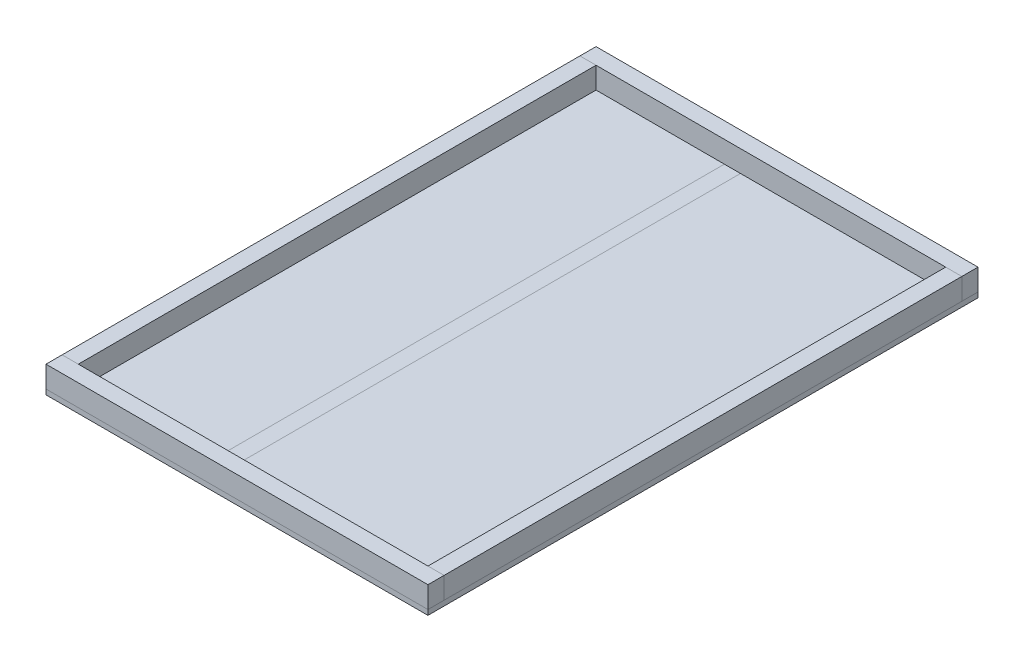
ISO-10303-21;
HEADER;
FILE_DESCRIPTION(('STEP AP214'),'2;1');
FILE_NAME('part.step','',(''),(''),'','','');
FILE_SCHEMA(('AUTOMOTIVE_DESIGN { 1 0 10303 214 1 1 1 1 }'));
ENDSEC;
DATA;
#1=APPLICATION_CONTEXT('core data for automotive mechanical design processes');
#2=APPLICATION_PROTOCOL_DEFINITION('international standard','automotive_design',2000,#1);
#3=PRODUCT_CONTEXT('',#1,'mechanical');
#4=PRODUCT('Part','Part','',(#3));
#5=PRODUCT_RELATED_PRODUCT_CATEGORY('part','',(#4));
#6=PRODUCT_DEFINITION_FORMATION('','',#4);
#7=PRODUCT_DEFINITION_CONTEXT('part definition',#1,'design');
#8=PRODUCT_DEFINITION('design','',#6,#7);
#9=PRODUCT_DEFINITION_SHAPE('','',#8);
#10=(LENGTH_UNIT() NAMED_UNIT(*) SI_UNIT(.MILLI.,.METRE.));
#11=(NAMED_UNIT(*) PLANE_ANGLE_UNIT() SI_UNIT($,.RADIAN.));
#12=(NAMED_UNIT(*) SI_UNIT($,.STERADIAN.) SOLID_ANGLE_UNIT());
#13=UNCERTAINTY_MEASURE_WITH_UNIT(LENGTH_MEASURE(1.E-05),#10,'distance_accuracy_value','');
#14=(GEOMETRIC_REPRESENTATION_CONTEXT(3) GLOBAL_UNCERTAINTY_ASSIGNED_CONTEXT((#13)) GLOBAL_UNIT_ASSIGNED_CONTEXT((#10,
#11,#12)) REPRESENTATION_CONTEXT('',''));
#15=CARTESIAN_POINT('',(0.,0.,0.));
#16=DIRECTION('',(0.,0.,1.));
#17=DIRECTION('',(1.,0.,0.));
#18=AXIS2_PLACEMENT_3D('',#15,#16,#17);
#19=CARTESIAN_POINT('',(-35.8750000000001,-9.525,305.55));
#20=DIRECTION('',(1.,0.,0.));
#21=DIRECTION('',(0.,0.,-1.));
#22=AXIS2_PLACEMENT_3D('',#19,#20,#21);
#23=PLANE('',#22);
#24=DIRECTION('',(0.,0.,-1.));
#25=VECTOR('',#24,1.);
#26=CARTESIAN_POINT('',(-35.8750000000001,0.,305.55));
#27=LINE('',#26,#25);
#28=CARTESIAN_POINT('',(-35.8750000000001,0.,305.55));
#29=VERTEX_POINT('',#28);
#30=CARTESIAN_POINT('',(-35.8750000000001,0.,-305.55));
#31=VERTEX_POINT('',#30);
#32=EDGE_CURVE('E142',#29,#31,#27,.T.);
#33=ORIENTED_EDGE('',*,*,#32,.F.);
#34=DIRECTION('',(0.,1.,0.));
#35=VECTOR('',#34,1.);
#36=CARTESIAN_POINT('',(-35.8750000000001,-9.525,305.55));
#37=LINE('',#36,#35);
#38=CARTESIAN_POINT('',(-35.8750000000001,-9.525,305.55));
#39=VERTEX_POINT('',#38);
#40=EDGE_CURVE('E13',#39,#29,#37,.T.);
#41=ORIENTED_EDGE('',*,*,#40,.F.);
#42=DIRECTION('',(0.,0.,-1.));
#43=VECTOR('',#42,1.);
#44=CARTESIAN_POINT('',(-35.8750000000001,-9.525,305.55));
#45=LINE('',#44,#43);
#46=CARTESIAN_POINT('',(-35.8750000000001,-9.525,-305.55));
#47=VERTEX_POINT('',#46);
#48=EDGE_CURVE('E136',#39,#47,#45,.T.);
#49=ORIENTED_EDGE('',*,*,#48,.T.);
#50=DIRECTION('',(0.,1.,0.));
#51=VECTOR('',#50,1.);
#52=CARTESIAN_POINT('',(-35.8750000000001,-9.525,-305.55));
#53=LINE('',#52,#51);
#54=EDGE_CURVE('E81',#47,#31,#53,.T.);
#55=ORIENTED_EDGE('',*,*,#54,.T.);
#56=EDGE_LOOP('',(#33,#41,#49,#55));
#57=FACE_BOUND('',#56,.T.);
#58=ADVANCED_FACE('F78',(#57),#23,.T.);
#59=CARTESIAN_POINT('',(-54.9250000000001,-9.525,305.55));
#60=DIRECTION('',(0.,0.,1.));
#61=DIRECTION('',(1.,0.,0.));
#62=AXIS2_PLACEMENT_3D('',#59,#60,#61);
#63=PLANE('',#62);
#64=DIRECTION('',(1.,0.,0.));
#65=VECTOR('',#64,1.);
#66=CARTESIAN_POINT('',(-54.9250000000001,0.,305.55));
#67=LINE('',#66,#65);
#68=CARTESIAN_POINT('',(-54.9250000000001,0.,305.55));
#69=VERTEX_POINT('',#68);
#70=EDGE_CURVE('E138',#69,#29,#67,.T.);
#71=ORIENTED_EDGE('',*,*,#70,.F.);
#72=DIRECTION('',(0.,1.,0.));
#73=VECTOR('',#72,1.);
#74=CARTESIAN_POINT('',(-54.9250000000001,-9.525,305.55));
#75=LINE('',#74,#73);
#76=CARTESIAN_POINT('',(-54.9250000000001,-9.525,305.55));
#77=VERTEX_POINT('',#76);
#78=EDGE_CURVE('E87',#77,#69,#75,.T.);
#79=ORIENTED_EDGE('',*,*,#78,.F.);
#80=DIRECTION('',(1.,0.,0.));
#81=VECTOR('',#80,1.);
#82=CARTESIAN_POINT('',(-54.9250000000001,-9.525,305.55));
#83=LINE('',#82,#81);
#84=EDGE_CURVE('E133',#77,#39,#83,.T.);
#85=ORIENTED_EDGE('',*,*,#84,.T.);
#86=ORIENTED_EDGE('',*,*,#40,.T.);
#87=EDGE_LOOP('',(#71,#79,#85,#86));
#88=FACE_BOUND('',#87,.T.);
#89=ADVANCED_FACE('F152',(#88),#63,.T.);
#90=CARTESIAN_POINT('',(-54.9250000000001,-9.525,305.55));
#91=DIRECTION('',(-1.,0.,0.));
#92=DIRECTION('',(0.,0.,1.));
#93=AXIS2_PLACEMENT_3D('',#90,#91,#92);
#94=PLANE('',#93);
#95=DIRECTION('',(0.,0.,1.));
#96=VECTOR('',#95,1.);
#97=CARTESIAN_POINT('',(-54.9250000000001,0.,305.55));
#98=LINE('',#97,#96);
#99=CARTESIAN_POINT('',(-54.9250000000001,0.,-305.55));
#100=VERTEX_POINT('',#99);
#101=EDGE_CURVE('E128',#100,#69,#98,.T.);
#102=ORIENTED_EDGE('',*,*,#101,.F.);
#103=DIRECTION('',(0.,1.,0.));
#104=VECTOR('',#103,1.);
#105=CARTESIAN_POINT('',(-54.9250000000001,-9.525,-305.55));
#106=LINE('',#105,#104);
#107=CARTESIAN_POINT('',(-54.9250000000001,-9.525,-305.55));
#108=VERTEX_POINT('',#107);
#109=EDGE_CURVE('E123',#108,#100,#106,.T.);
#110=ORIENTED_EDGE('',*,*,#109,.F.);
#111=DIRECTION('',(0.,0.,1.));
#112=VECTOR('',#111,1.);
#113=CARTESIAN_POINT('',(-54.9250000000001,-9.525,305.55));
#114=LINE('',#113,#112);
#115=EDGE_CURVE('E126',#108,#77,#114,.T.);
#116=ORIENTED_EDGE('',*,*,#115,.T.);
#117=ORIENTED_EDGE('',*,*,#78,.T.);
#118=EDGE_LOOP('',(#102,#110,#116,#117));
#119=FACE_BOUND('',#118,.T.);
#120=ADVANCED_FACE('F125',(#119),#94,.T.);
#121=CARTESIAN_POINT('',(-54.9250000000001,-9.525,-305.55));
#122=DIRECTION('',(0.,0.,-1.));
#123=DIRECTION('',(-1.,0.,0.));
#124=AXIS2_PLACEMENT_3D('',#121,#122,#123);
#125=PLANE('',#124);
#126=DIRECTION('',(-1.,0.,0.));
#127=VECTOR('',#126,1.);
#128=CARTESIAN_POINT('',(-54.9250000000001,0.,-305.55));
#129=LINE('',#128,#127);
#130=EDGE_CURVE('E145',#31,#100,#129,.T.);
#131=ORIENTED_EDGE('',*,*,#130,.F.);
#132=ORIENTED_EDGE('',*,*,#54,.F.);
#133=DIRECTION('',(-1.,0.,0.));
#134=VECTOR('',#133,1.);
#135=CARTESIAN_POINT('',(-54.9250000000001,-9.525,-305.55));
#136=LINE('',#135,#134);
#137=EDGE_CURVE('E132',#47,#108,#136,.T.);
#138=ORIENTED_EDGE('',*,*,#137,.T.);
#139=ORIENTED_EDGE('',*,*,#109,.T.);
#140=EDGE_LOOP('',(#131,#132,#138,#139));
#141=FACE_BOUND('',#140,.T.);
#142=ADVANCED_FACE('F135',(#141),#125,.T.);
#143=CARTESIAN_POINT('',(0.,-9.525,0.));
#144=DIRECTION('',(0.,-1.,0.));
#145=DIRECTION('',(0.,0.,-1.));
#146=AXIS2_PLACEMENT_3D('',#143,#144,#145);
#147=PLANE('',#146);
#148=ORIENTED_EDGE('',*,*,#48,.F.);
#149=ORIENTED_EDGE('',*,*,#84,.F.);
#150=ORIENTED_EDGE('',*,*,#115,.F.);
#151=ORIENTED_EDGE('',*,*,#137,.F.);
#152=EDGE_LOOP('',(#148,#149,#150,#151));
#153=FACE_BOUND('',#152,.T.);
#154=ADVANCED_FACE('F131',(#153),#147,.T.);
#155=CARTESIAN_POINT('',(0.,0.,0.));
#156=DIRECTION('',(0.,-1.,0.));
#157=DIRECTION('',(0.,0.,-1.));
#158=AXIS2_PLACEMENT_3D('',#155,#156,#157);
#159=PLANE('',#158);
#160=ORIENTED_EDGE('',*,*,#32,.T.);
#161=ORIENTED_EDGE('',*,*,#130,.T.);
#162=ORIENTED_EDGE('',*,*,#101,.T.);
#163=ORIENTED_EDGE('',*,*,#70,.T.);
#164=EDGE_LOOP('',(#160,#161,#162,#163));
#165=FACE_BOUND('',#164,.T.);
#166=ADVANCED_FACE('F151',(#165),#159,.F.);
#167=CLOSED_SHELL('',(#58,#89,#120,#142,#154,#166));
#168=MANIFOLD_SOLID_BREP('B2',#167);
#169=CARTESIAN_POINT('',(0.,25.4,305.55));
#170=DIRECTION('',(0.,0.,-1.));
#171=DIRECTION('',(-1.,0.,0.));
#172=AXIS2_PLACEMENT_3D('',#169,#170,#171);
#173=PLANE('',#172);
#174=DIRECTION('',(1.,0.,0.));
#175=VECTOR('',#174,1.);
#176=CARTESIAN_POINT('',(0.,0.,305.55));
#177=LINE('',#176,#175);
#178=CARTESIAN_POINT('',(-225.4,0.,305.55));
#179=VERTEX_POINT('',#178);
#180=CARTESIAN_POINT('',(225.4,0.,305.55));
#181=VERTEX_POINT('',#180);
#182=EDGE_CURVE('E276',#179,#181,#177,.T.);
#183=ORIENTED_EDGE('',*,*,#182,.F.);
#184=DIRECTION('',(0.,-1.,0.));
#185=VECTOR('',#184,1.);
#186=CARTESIAN_POINT('',(-225.4,25.4,305.55));
#187=LINE('',#186,#185);
#188=CARTESIAN_POINT('',(-225.4,25.4,305.55));
#189=VERTEX_POINT('',#188);
#190=EDGE_CURVE('E76',#189,#179,#187,.T.);
#191=ORIENTED_EDGE('',*,*,#190,.F.);
#192=DIRECTION('',(1.,0.,0.));
#193=VECTOR('',#192,1.);
#194=CARTESIAN_POINT('',(0.,25.4,305.55));
#195=LINE('',#194,#193);
#196=CARTESIAN_POINT('',(225.4,25.4,305.55));
#197=VERTEX_POINT('',#196);
#198=EDGE_CURVE('E270',#189,#197,#195,.T.);
#199=ORIENTED_EDGE('',*,*,#198,.T.);
#200=DIRECTION('',(0.,-1.,0.));
#201=VECTOR('',#200,1.);
#202=CARTESIAN_POINT('',(225.4,25.4,305.55));
#203=LINE('',#202,#201);
#204=EDGE_CURVE('E251',#197,#181,#203,.T.);
#205=ORIENTED_EDGE('',*,*,#204,.T.);
#206=EDGE_LOOP('',(#183,#191,#199,#205));
#207=FACE_BOUND('',#206,.T.);
#208=ADVANCED_FACE('F213',(#207),#173,.T.);
#209=CARTESIAN_POINT('',(-225.4,25.4,0.));
#210=DIRECTION('',(-1.,0.,0.));
#211=DIRECTION('',(0.,0.,1.));
#212=AXIS2_PLACEMENT_3D('',#209,#210,#211);
#213=PLANE('',#212);
#214=DIRECTION('',(0.,0.,-1.));
#215=VECTOR('',#214,1.);
#216=CARTESIAN_POINT('',(-225.4,0.,0.));
#217=LINE('',#216,#215);
#218=CARTESIAN_POINT('',(-225.4,0.,324.6));
#219=VERTEX_POINT('',#218);
#220=EDGE_CURVE('E264',#219,#179,#217,.T.);
#221=ORIENTED_EDGE('',*,*,#220,.F.);
#222=DIRECTION('',(0.,-1.,0.));
#223=VECTOR('',#222,1.);
#224=CARTESIAN_POINT('',(-225.4,25.4,324.6));
#225=LINE('',#224,#223);
#226=CARTESIAN_POINT('',(-225.4,25.4,324.6));
#227=VERTEX_POINT('',#226);
#228=EDGE_CURVE('E221',#227,#219,#225,.T.);
#229=ORIENTED_EDGE('',*,*,#228,.F.);
#230=DIRECTION('',(0.,0.,-1.));
#231=VECTOR('',#230,1.);
#232=CARTESIAN_POINT('',(-225.4,25.4,0.));
#233=LINE('',#232,#231);
#234=EDGE_CURVE('E262',#227,#189,#233,.T.);
#235=ORIENTED_EDGE('',*,*,#234,.T.);
#236=ORIENTED_EDGE('',*,*,#190,.T.);
#237=EDGE_LOOP('',(#221,#229,#235,#236));
#238=FACE_BOUND('',#237,.T.);
#239=ADVANCED_FACE('F260',(#238),#213,.T.);
#240=CARTESIAN_POINT('',(0.,25.4,324.6));
#241=DIRECTION('',(0.,0.,-1.));
#242=DIRECTION('',(-1.,0.,0.));
#243=AXIS2_PLACEMENT_3D('',#240,#241,#242);
#244=PLANE('',#243);
#245=DIRECTION('',(1.,0.,0.));
#246=VECTOR('',#245,1.);
#247=CARTESIAN_POINT('',(0.,0.,324.6));
#248=LINE('',#247,#246);
#249=CARTESIAN_POINT('',(225.4,0.,324.6));
#250=VERTEX_POINT('',#249);
#251=EDGE_CURVE('E244',#219,#250,#248,.T.);
#252=ORIENTED_EDGE('',*,*,#251,.T.);
#253=DIRECTION('',(0.,-1.,0.));
#254=VECTOR('',#253,1.);
#255=CARTESIAN_POINT('',(225.4,25.4,324.6));
#256=LINE('',#255,#254);
#257=CARTESIAN_POINT('',(225.4,25.4,324.6));
#258=VERTEX_POINT('',#257);
#259=EDGE_CURVE('E265',#258,#250,#256,.T.);
#260=ORIENTED_EDGE('',*,*,#259,.F.);
#261=DIRECTION('',(1.,0.,0.));
#262=VECTOR('',#261,1.);
#263=CARTESIAN_POINT('',(0.,25.4,324.6));
#264=LINE('',#263,#262);
#265=EDGE_CURVE('E266',#227,#258,#264,.T.);
#266=ORIENTED_EDGE('',*,*,#265,.F.);
#267=ORIENTED_EDGE('',*,*,#228,.T.);
#268=EDGE_LOOP('',(#252,#260,#266,#267));
#269=FACE_BOUND('',#268,.T.);
#270=ADVANCED_FACE('F267',(#269),#244,.F.);
#271=CARTESIAN_POINT('',(225.4,25.4,0.));
#272=DIRECTION('',(-1.,0.,0.));
#273=DIRECTION('',(0.,0.,1.));
#274=AXIS2_PLACEMENT_3D('',#271,#272,#273);
#275=PLANE('',#274);
#276=DIRECTION('',(0.,0.,-1.));
#277=VECTOR('',#276,1.);
#278=CARTESIAN_POINT('',(225.4,0.,0.));
#279=LINE('',#278,#277);
#280=EDGE_CURVE('E272',#250,#181,#279,.T.);
#281=ORIENTED_EDGE('',*,*,#280,.T.);
#282=ORIENTED_EDGE('',*,*,#204,.F.);
#283=DIRECTION('',(0.,0.,-1.));
#284=VECTOR('',#283,1.);
#285=CARTESIAN_POINT('',(225.4,25.4,0.));
#286=LINE('',#285,#284);
#287=EDGE_CURVE('E229',#258,#197,#286,.T.);
#288=ORIENTED_EDGE('',*,*,#287,.F.);
#289=ORIENTED_EDGE('',*,*,#259,.T.);
#290=EDGE_LOOP('',(#281,#282,#288,#289));
#291=FACE_BOUND('',#290,.T.);
#292=ADVANCED_FACE('F285',(#291),#275,.F.);
#293=CARTESIAN_POINT('',(0.,25.4,0.));
#294=DIRECTION('',(0.,1.,0.));
#295=DIRECTION('',(0.,0.,1.));
#296=AXIS2_PLACEMENT_3D('',#293,#294,#295);
#297=PLANE('',#296);
#298=ORIENTED_EDGE('',*,*,#198,.F.);
#299=ORIENTED_EDGE('',*,*,#234,.F.);
#300=ORIENTED_EDGE('',*,*,#265,.T.);
#301=ORIENTED_EDGE('',*,*,#287,.T.);
#302=EDGE_LOOP('',(#298,#299,#300,#301));
#303=FACE_BOUND('',#302,.T.);
#304=ADVANCED_FACE('F269',(#303),#297,.T.);
#305=CARTESIAN_POINT('',(0.,0.,0.));
#306=DIRECTION('',(0.,1.,0.));
#307=DIRECTION('',(0.,0.,1.));
#308=AXIS2_PLACEMENT_3D('',#305,#306,#307);
#309=PLANE('',#308);
#310=ORIENTED_EDGE('',*,*,#182,.T.);
#311=ORIENTED_EDGE('',*,*,#280,.F.);
#312=ORIENTED_EDGE('',*,*,#251,.F.);
#313=ORIENTED_EDGE('',*,*,#220,.T.);
#314=EDGE_LOOP('',(#310,#311,#312,#313));
#315=FACE_BOUND('',#314,.T.);
#316=ADVANCED_FACE('F287',(#315),#309,.F.);
#317=CLOSED_SHELL('',(#208,#239,#270,#292,#304,#316));
#318=MANIFOLD_SOLID_BREP('B7',#317);
#319=CARTESIAN_POINT('',(0.,25.4,-305.55));
#320=DIRECTION('',(0.,0.,1.));
#321=DIRECTION('',(1.,0.,0.));
#322=AXIS2_PLACEMENT_3D('',#319,#320,#321);
#323=PLANE('',#322);
#324=DIRECTION('',(-1.,0.,0.));
#325=VECTOR('',#324,1.);
#326=CARTESIAN_POINT('',(0.,0.,-305.55));
#327=LINE('',#326,#325);
#328=CARTESIAN_POINT('',(225.4,0.,-305.55));
#329=VERTEX_POINT('',#328);
#330=CARTESIAN_POINT('',(-225.4,0.,-305.55));
#331=VERTEX_POINT('',#330);
#332=EDGE_CURVE('E415',#329,#331,#327,.T.);
#333=ORIENTED_EDGE('',*,*,#332,.F.);
#334=DIRECTION('',(0.,-1.,0.));
#335=VECTOR('',#334,1.);
#336=CARTESIAN_POINT('',(225.4,25.4,-305.55));
#337=LINE('',#336,#335);
#338=CARTESIAN_POINT('',(225.4,25.4,-305.55));
#339=VERTEX_POINT('',#338);
#340=EDGE_CURVE('E211',#339,#329,#337,.T.);
#341=ORIENTED_EDGE('',*,*,#340,.F.);
#342=DIRECTION('',(-1.,0.,0.));
#343=VECTOR('',#342,1.);
#344=CARTESIAN_POINT('',(0.,25.4,-305.55));
#345=LINE('',#344,#343);
#346=CARTESIAN_POINT('',(-225.4,25.4,-305.55));
#347=VERTEX_POINT('',#346);
#348=EDGE_CURVE('E400',#339,#347,#345,.T.);
#349=ORIENTED_EDGE('',*,*,#348,.T.);
#350=DIRECTION('',(0.,-1.,0.));
#351=VECTOR('',#350,1.);
#352=CARTESIAN_POINT('',(-225.4,25.4,-305.55));
#353=LINE('',#352,#351);
#354=EDGE_CURVE('E368',#347,#331,#353,.T.);
#355=ORIENTED_EDGE('',*,*,#354,.T.);
#356=EDGE_LOOP('',(#333,#341,#349,#355));
#357=FACE_BOUND('',#356,.T.);
#358=ADVANCED_FACE('F352',(#357),#323,.T.);
#359=CARTESIAN_POINT('',(225.4,25.4,0.));
#360=DIRECTION('',(-1.,0.,0.));
#361=DIRECTION('',(0.,0.,1.));
#362=AXIS2_PLACEMENT_3D('',#359,#360,#361);
#363=PLANE('',#362);
#364=DIRECTION('',(0.,0.,-1.));
#365=VECTOR('',#364,1.);
#366=CARTESIAN_POINT('',(225.4,0.,0.));
#367=LINE('',#366,#365);
#368=CARTESIAN_POINT('',(225.4,0.,-324.6));
#369=VERTEX_POINT('',#368);
#370=EDGE_CURVE('E406',#329,#369,#367,.T.);
#371=ORIENTED_EDGE('',*,*,#370,.T.);
#372=DIRECTION('',(0.,-1.,0.));
#373=VECTOR('',#372,1.);
#374=CARTESIAN_POINT('',(225.4,25.4,-324.6));
#375=LINE('',#374,#373);
#376=CARTESIAN_POINT('',(225.4,25.4,-324.6));
#377=VERTEX_POINT('',#376);
#378=EDGE_CURVE('E360',#377,#369,#375,.T.);
#379=ORIENTED_EDGE('',*,*,#378,.F.);
#380=DIRECTION('',(0.,0.,-1.));
#381=VECTOR('',#380,1.);
#382=CARTESIAN_POINT('',(225.4,25.4,0.));
#383=LINE('',#382,#381);
#384=EDGE_CURVE('E394',#339,#377,#383,.T.);
#385=ORIENTED_EDGE('',*,*,#384,.F.);
#386=ORIENTED_EDGE('',*,*,#340,.T.);
#387=EDGE_LOOP('',(#371,#379,#385,#386));
#388=FACE_BOUND('',#387,.T.);
#389=ADVANCED_FACE('F404',(#388),#363,.F.);
#390=CARTESIAN_POINT('',(0.,25.4,-324.6));
#391=DIRECTION('',(0.,0.,-1.));
#392=DIRECTION('',(-1.,0.,0.));
#393=AXIS2_PLACEMENT_3D('',#390,#391,#392);
#394=PLANE('',#393);
#395=DIRECTION('',(1.,0.,0.));
#396=VECTOR('',#395,1.);
#397=CARTESIAN_POINT('',(0.,0.,-324.6));
#398=LINE('',#397,#396);
#399=CARTESIAN_POINT('',(-225.4,0.,-324.6));
#400=VERTEX_POINT('',#399);
#401=EDGE_CURVE('E418',#400,#369,#398,.T.);
#402=ORIENTED_EDGE('',*,*,#401,.F.);
#403=DIRECTION('',(0.,-1.,0.));
#404=VECTOR('',#403,1.);
#405=CARTESIAN_POINT('',(-225.4,25.4,-324.6));
#406=LINE('',#405,#404);
#407=CARTESIAN_POINT('',(-225.4,25.4,-324.6));
#408=VERTEX_POINT('',#407);
#409=EDGE_CURVE('E381',#408,#400,#406,.T.);
#410=ORIENTED_EDGE('',*,*,#409,.F.);
#411=DIRECTION('',(1.,0.,0.));
#412=VECTOR('',#411,1.);
#413=CARTESIAN_POINT('',(0.,25.4,-324.6));
#414=LINE('',#413,#412);
#415=EDGE_CURVE('E399',#408,#377,#414,.T.);
#416=ORIENTED_EDGE('',*,*,#415,.T.);
#417=ORIENTED_EDGE('',*,*,#378,.T.);
#418=EDGE_LOOP('',(#402,#410,#416,#417));
#419=FACE_BOUND('',#418,.T.);
#420=ADVANCED_FACE('F409',(#419),#394,.T.);
#421=CARTESIAN_POINT('',(-225.4,25.4,0.));
#422=DIRECTION('',(-1.,0.,0.));
#423=DIRECTION('',(0.,0.,1.));
#424=AXIS2_PLACEMENT_3D('',#421,#422,#423);
#425=PLANE('',#424);
#426=DIRECTION('',(0.,0.,-1.));
#427=VECTOR('',#426,1.);
#428=CARTESIAN_POINT('',(-225.4,0.,0.));
#429=LINE('',#428,#427);
#430=EDGE_CURVE('E420',#331,#400,#429,.T.);
#431=ORIENTED_EDGE('',*,*,#430,.F.);
#432=ORIENTED_EDGE('',*,*,#354,.F.);
#433=DIRECTION('',(0.,0.,-1.));
#434=VECTOR('',#433,1.);
#435=CARTESIAN_POINT('',(-225.4,25.4,0.));
#436=LINE('',#435,#434);
#437=EDGE_CURVE('E410',#347,#408,#436,.T.);
#438=ORIENTED_EDGE('',*,*,#437,.T.);
#439=ORIENTED_EDGE('',*,*,#409,.T.);
#440=EDGE_LOOP('',(#431,#432,#438,#439));
#441=FACE_BOUND('',#440,.T.);
#442=ADVANCED_FACE('F425',(#441),#425,.T.);
#443=CARTESIAN_POINT('',(0.,25.4,0.));
#444=DIRECTION('',(0.,1.,0.));
#445=DIRECTION('',(0.,0.,1.));
#446=AXIS2_PLACEMENT_3D('',#443,#444,#445);
#447=PLANE('',#446);
#448=ORIENTED_EDGE('',*,*,#348,.F.);
#449=ORIENTED_EDGE('',*,*,#384,.T.);
#450=ORIENTED_EDGE('',*,*,#415,.F.);
#451=ORIENTED_EDGE('',*,*,#437,.F.);
#452=EDGE_LOOP('',(#448,#449,#450,#451));
#453=FACE_BOUND('',#452,.T.);
#454=ADVANCED_FACE('F396',(#453),#447,.T.);
#455=CARTESIAN_POINT('',(0.,0.,0.));
#456=DIRECTION('',(0.,1.,0.));
#457=DIRECTION('',(0.,0.,1.));
#458=AXIS2_PLACEMENT_3D('',#455,#456,#457);
#459=PLANE('',#458);
#460=ORIENTED_EDGE('',*,*,#332,.T.);
#461=ORIENTED_EDGE('',*,*,#430,.T.);
#462=ORIENTED_EDGE('',*,*,#401,.T.);
#463=ORIENTED_EDGE('',*,*,#370,.F.);
#464=EDGE_LOOP('',(#460,#461,#462,#463));
#465=FACE_BOUND('',#464,.T.);
#466=ADVANCED_FACE('F432',(#465),#459,.F.);
#467=CLOSED_SHELL('',(#358,#389,#420,#442,#454,#466));
#468=MANIFOLD_SOLID_BREP('B70',#467);
#469=CARTESIAN_POINT('',(206.35,25.4,0.));
#470=DIRECTION('',(-1.,0.,0.));
#471=DIRECTION('',(0.,0.,1.));
#472=AXIS2_PLACEMENT_3D('',#469,#470,#471);
#473=PLANE('',#472);
#474=DIRECTION('',(0.,0.,-1.));
#475=VECTOR('',#474,1.);
#476=CARTESIAN_POINT('',(206.35,0.,0.));
#477=LINE('',#476,#475);
#478=CARTESIAN_POINT('',(206.35,0.,305.55));
#479=VERTEX_POINT('',#478);
#480=CARTESIAN_POINT('',(206.35,0.,-305.55));
#481=VERTEX_POINT('',#480);
#482=EDGE_CURVE('E554',#479,#481,#477,.T.);
#483=ORIENTED_EDGE('',*,*,#482,.F.);
#484=DIRECTION('',(0.,-1.,0.));
#485=VECTOR('',#484,1.);
#486=CARTESIAN_POINT('',(206.35,25.4,305.55));
#487=LINE('',#486,#485);
#488=CARTESIAN_POINT('',(206.35,25.4,305.55));
#489=VERTEX_POINT('',#488);
#490=EDGE_CURVE('E350',#489,#479,#487,.T.);
#491=ORIENTED_EDGE('',*,*,#490,.F.);
#492=DIRECTION('',(0.,0.,-1.));
#493=VECTOR('',#492,1.);
#494=CARTESIAN_POINT('',(206.35,25.4,0.));
#495=LINE('',#494,#493);
#496=CARTESIAN_POINT('',(206.35,25.4,-305.55));
#497=VERTEX_POINT('',#496);
#498=EDGE_CURVE('E539',#489,#497,#495,.T.);
#499=ORIENTED_EDGE('',*,*,#498,.T.);
#500=DIRECTION('',(0.,-1.,0.));
#501=VECTOR('',#500,1.);
#502=CARTESIAN_POINT('',(206.35,25.4,-305.55));
#503=LINE('',#502,#501);
#504=EDGE_CURVE('E507',#497,#481,#503,.T.);
#505=ORIENTED_EDGE('',*,*,#504,.T.);
#506=EDGE_LOOP('',(#483,#491,#499,#505));
#507=FACE_BOUND('',#506,.T.);
#508=ADVANCED_FACE('F491',(#507),#473,.T.);
#509=CARTESIAN_POINT('',(0.,25.4,305.55));
#510=DIRECTION('',(0.,0.,-1.));
#511=DIRECTION('',(-1.,0.,0.));
#512=AXIS2_PLACEMENT_3D('',#509,#510,#511);
#513=PLANE('',#512);
#514=DIRECTION('',(1.,0.,0.));
#515=VECTOR('',#514,1.);
#516=CARTESIAN_POINT('',(0.,0.,305.55));
#517=LINE('',#516,#515);
#518=CARTESIAN_POINT('',(225.4,0.,305.55));
#519=VERTEX_POINT('',#518);
#520=EDGE_CURVE('E545',#479,#519,#517,.T.);
#521=ORIENTED_EDGE('',*,*,#520,.T.);
#522=DIRECTION('',(0.,-1.,0.));
#523=VECTOR('',#522,1.);
#524=CARTESIAN_POINT('',(225.4,25.4,305.55));
#525=LINE('',#524,#523);
#526=CARTESIAN_POINT('',(225.4,25.4,305.55));
#527=VERTEX_POINT('',#526);
#528=EDGE_CURVE('E499',#527,#519,#525,.T.);
#529=ORIENTED_EDGE('',*,*,#528,.F.);
#530=DIRECTION('',(1.,0.,0.));
#531=VECTOR('',#530,1.);
#532=CARTESIAN_POINT('',(0.,25.4,305.55));
#533=LINE('',#532,#531);
#534=EDGE_CURVE('E533',#489,#527,#533,.T.);
#535=ORIENTED_EDGE('',*,*,#534,.F.);
#536=ORIENTED_EDGE('',*,*,#490,.T.);
#537=EDGE_LOOP('',(#521,#529,#535,#536));
#538=FACE_BOUND('',#537,.T.);
#539=ADVANCED_FACE('F543',(#538),#513,.F.);
#540=CARTESIAN_POINT('',(225.4,25.4,0.));
#541=DIRECTION('',(-1.,0.,0.));
#542=DIRECTION('',(0.,0.,1.));
#543=AXIS2_PLACEMENT_3D('',#540,#541,#542);
#544=PLANE('',#543);
#545=DIRECTION('',(0.,0.,-1.));
#546=VECTOR('',#545,1.);
#547=CARTESIAN_POINT('',(225.4,0.,0.));
#548=LINE('',#547,#546);
#549=CARTESIAN_POINT('',(225.4,0.,-305.55));
#550=VERTEX_POINT('',#549);
#551=EDGE_CURVE('E557',#519,#550,#548,.T.);
#552=ORIENTED_EDGE('',*,*,#551,.T.);
#553=DIRECTION('',(0.,-1.,0.));
#554=VECTOR('',#553,1.);
#555=CARTESIAN_POINT('',(225.4,25.4,-305.55));
#556=LINE('',#555,#554);
#557=CARTESIAN_POINT('',(225.4,25.4,-305.55));
#558=VERTEX_POINT('',#557);
#559=EDGE_CURVE('E521',#558,#550,#556,.T.);
#560=ORIENTED_EDGE('',*,*,#559,.F.);
#561=DIRECTION('',(0.,0.,-1.));
#562=VECTOR('',#561,1.);
#563=CARTESIAN_POINT('',(225.4,25.4,0.));
#564=LINE('',#563,#562);
#565=EDGE_CURVE('E538',#527,#558,#564,.T.);
#566=ORIENTED_EDGE('',*,*,#565,.F.);
#567=ORIENTED_EDGE('',*,*,#528,.T.);
#568=EDGE_LOOP('',(#552,#560,#566,#567));
#569=FACE_BOUND('',#568,.T.);
#570=ADVANCED_FACE('F548',(#569),#544,.F.);
#571=CARTESIAN_POINT('',(0.,25.4,-305.55));
#572=DIRECTION('',(0.,0.,-1.));
#573=DIRECTION('',(-1.,0.,0.));
#574=AXIS2_PLACEMENT_3D('',#571,#572,#573);
#575=PLANE('',#574);
#576=DIRECTION('',(1.,0.,0.));
#577=VECTOR('',#576,1.);
#578=CARTESIAN_POINT('',(0.,0.,-305.55));
#579=LINE('',#578,#577);
#580=EDGE_CURVE('E559',#481,#550,#579,.T.);
#581=ORIENTED_EDGE('',*,*,#580,.F.);
#582=ORIENTED_EDGE('',*,*,#504,.F.);
#583=DIRECTION('',(1.,0.,0.));
#584=VECTOR('',#583,1.);
#585=CARTESIAN_POINT('',(0.,25.4,-305.55));
#586=LINE('',#585,#584);
#587=EDGE_CURVE('E549',#497,#558,#586,.T.);
#588=ORIENTED_EDGE('',*,*,#587,.T.);
#589=ORIENTED_EDGE('',*,*,#559,.T.);
#590=EDGE_LOOP('',(#581,#582,#588,#589));
#591=FACE_BOUND('',#590,.T.);
#592=ADVANCED_FACE('F564',(#591),#575,.T.);
#593=CARTESIAN_POINT('',(0.,25.4,0.));
#594=DIRECTION('',(0.,1.,0.));
#595=DIRECTION('',(0.,0.,1.));
#596=AXIS2_PLACEMENT_3D('',#593,#594,#595);
#597=PLANE('',#596);
#598=ORIENTED_EDGE('',*,*,#498,.F.);
#599=ORIENTED_EDGE('',*,*,#534,.T.);
#600=ORIENTED_EDGE('',*,*,#565,.T.);
#601=ORIENTED_EDGE('',*,*,#587,.F.);
#602=EDGE_LOOP('',(#598,#599,#600,#601));
#603=FACE_BOUND('',#602,.T.);
#604=ADVANCED_FACE('F535',(#603),#597,.T.);
#605=CARTESIAN_POINT('',(0.,0.,0.));
#606=DIRECTION('',(0.,1.,0.));
#607=DIRECTION('',(0.,0.,1.));
#608=AXIS2_PLACEMENT_3D('',#605,#606,#607);
#609=PLANE('',#608);
#610=ORIENTED_EDGE('',*,*,#482,.T.);
#611=ORIENTED_EDGE('',*,*,#580,.T.);
#612=ORIENTED_EDGE('',*,*,#551,.F.);
#613=ORIENTED_EDGE('',*,*,#520,.F.);
#614=EDGE_LOOP('',(#610,#611,#612,#613));
#615=FACE_BOUND('',#614,.T.);
#616=ADVANCED_FACE('F571',(#615),#609,.F.);
#617=CLOSED_SHELL('',(#508,#539,#570,#592,#604,#616));
#618=MANIFOLD_SOLID_BREP('B205',#617);
#619=CARTESIAN_POINT('',(0.,25.4,305.55));
#620=DIRECTION('',(0.,0.,1.));
#621=DIRECTION('',(1.,0.,0.));
#622=AXIS2_PLACEMENT_3D('',#619,#620,#621);
#623=PLANE('',#622);
#624=DIRECTION('',(-1.,0.,0.));
#625=VECTOR('',#624,1.);
#626=CARTESIAN_POINT('',(0.,0.,305.55));
#627=LINE('',#626,#625);
#628=CARTESIAN_POINT('',(-206.35,0.,305.55));
#629=VERTEX_POINT('',#628);
#630=CARTESIAN_POINT('',(-225.4,0.,305.55));
#631=VERTEX_POINT('',#630);
#632=EDGE_CURVE('E686',#629,#631,#627,.T.);
#633=ORIENTED_EDGE('',*,*,#632,.F.);
#634=DIRECTION('',(0.,-1.,0.));
#635=VECTOR('',#634,1.);
#636=CARTESIAN_POINT('',(-206.35,25.4,305.55));
#637=LINE('',#636,#635);
#638=CARTESIAN_POINT('',(-206.35,25.4,305.55));
#639=VERTEX_POINT('',#638);
#640=EDGE_CURVE('E489',#639,#629,#637,.T.);
#641=ORIENTED_EDGE('',*,*,#640,.F.);
#642=DIRECTION('',(-1.,0.,0.));
#643=VECTOR('',#642,1.);
#644=CARTESIAN_POINT('',(0.,25.4,305.55));
#645=LINE('',#644,#643);
#646=CARTESIAN_POINT('',(-225.4,25.4,305.55));
#647=VERTEX_POINT('',#646);
#648=EDGE_CURVE('E671',#639,#647,#645,.T.);
#649=ORIENTED_EDGE('',*,*,#648,.T.);
#650=DIRECTION('',(0.,-1.,0.));
#651=VECTOR('',#650,1.);
#652=CARTESIAN_POINT('',(-225.4,25.4,305.55));
#653=LINE('',#652,#651);
#654=EDGE_CURVE('E639',#647,#631,#653,.T.);
#655=ORIENTED_EDGE('',*,*,#654,.T.);
#656=EDGE_LOOP('',(#633,#641,#649,#655));
#657=FACE_BOUND('',#656,.T.);
#658=ADVANCED_FACE('F623',(#657),#623,.T.);
#659=CARTESIAN_POINT('',(-206.35,25.4,0.));
#660=DIRECTION('',(-1.,0.,0.));
#661=DIRECTION('',(0.,0.,1.));
#662=AXIS2_PLACEMENT_3D('',#659,#660,#661);
#663=PLANE('',#662);
#664=DIRECTION('',(0.,0.,-1.));
#665=VECTOR('',#664,1.);
#666=CARTESIAN_POINT('',(-206.35,0.,0.));
#667=LINE('',#666,#665);
#668=CARTESIAN_POINT('',(-206.35,0.,-305.55));
#669=VERTEX_POINT('',#668);
#670=EDGE_CURVE('E677',#629,#669,#667,.T.);
#671=ORIENTED_EDGE('',*,*,#670,.T.);
#672=DIRECTION('',(0.,-1.,0.));
#673=VECTOR('',#672,1.);
#674=CARTESIAN_POINT('',(-206.35,25.4,-305.55));
#675=LINE('',#674,#673);
#676=CARTESIAN_POINT('',(-206.35,25.4,-305.55));
#677=VERTEX_POINT('',#676);
#678=EDGE_CURVE('E631',#677,#669,#675,.T.);
#679=ORIENTED_EDGE('',*,*,#678,.F.);
#680=DIRECTION('',(0.,0.,-1.));
#681=VECTOR('',#680,1.);
#682=CARTESIAN_POINT('',(-206.35,25.4,0.));
#683=LINE('',#682,#681);
#684=EDGE_CURVE('E665',#639,#677,#683,.T.);
#685=ORIENTED_EDGE('',*,*,#684,.F.);
#686=ORIENTED_EDGE('',*,*,#640,.T.);
#687=EDGE_LOOP('',(#671,#679,#685,#686));
#688=FACE_BOUND('',#687,.T.);
#689=ADVANCED_FACE('F675',(#688),#663,.F.);
#690=CARTESIAN_POINT('',(0.,25.4,-305.55));
#691=DIRECTION('',(0.,0.,1.));
#692=DIRECTION('',(1.,0.,0.));
#693=AXIS2_PLACEMENT_3D('',#690,#691,#692);
#694=PLANE('',#693);
#695=DIRECTION('',(-1.,0.,0.));
#696=VECTOR('',#695,1.);
#697=CARTESIAN_POINT('',(0.,0.,-305.55));
#698=LINE('',#697,#696);
#699=CARTESIAN_POINT('',(-225.4,0.,-305.55));
#700=VERTEX_POINT('',#699);
#701=EDGE_CURVE('E689',#669,#700,#698,.T.);
#702=ORIENTED_EDGE('',*,*,#701,.T.);
#703=DIRECTION('',(0.,-1.,0.));
#704=VECTOR('',#703,1.);
#705=CARTESIAN_POINT('',(-225.4,25.4,-305.55));
#706=LINE('',#705,#704);
#707=CARTESIAN_POINT('',(-225.4,25.4,-305.55));
#708=VERTEX_POINT('',#707);
#709=EDGE_CURVE('E653',#708,#700,#706,.T.);
#710=ORIENTED_EDGE('',*,*,#709,.F.);
#711=DIRECTION('',(-1.,0.,0.));
#712=VECTOR('',#711,1.);
#713=CARTESIAN_POINT('',(0.,25.4,-305.55));
#714=LINE('',#713,#712);
#715=EDGE_CURVE('E670',#677,#708,#714,.T.);
#716=ORIENTED_EDGE('',*,*,#715,.F.);
#717=ORIENTED_EDGE('',*,*,#678,.T.);
#718=EDGE_LOOP('',(#702,#710,#716,#717));
#719=FACE_BOUND('',#718,.T.);
#720=ADVANCED_FACE('F680',(#719),#694,.F.);
#721=CARTESIAN_POINT('',(-225.4,25.4,0.));
#722=DIRECTION('',(-1.,0.,0.));
#723=DIRECTION('',(0.,0.,1.));
#724=AXIS2_PLACEMENT_3D('',#721,#722,#723);
#725=PLANE('',#724);
#726=DIRECTION('',(0.,0.,-1.));
#727=VECTOR('',#726,1.);
#728=CARTESIAN_POINT('',(-225.4,0.,0.));
#729=LINE('',#728,#727);
#730=EDGE_CURVE('E691',#631,#700,#729,.T.);
#731=ORIENTED_EDGE('',*,*,#730,.F.);
#732=ORIENTED_EDGE('',*,*,#654,.F.);
#733=DIRECTION('',(0.,0.,-1.));
#734=VECTOR('',#733,1.);
#735=CARTESIAN_POINT('',(-225.4,25.4,0.));
#736=LINE('',#735,#734);
#737=EDGE_CURVE('E681',#647,#708,#736,.T.);
#738=ORIENTED_EDGE('',*,*,#737,.T.);
#739=ORIENTED_EDGE('',*,*,#709,.T.);
#740=EDGE_LOOP('',(#731,#732,#738,#739));
#741=FACE_BOUND('',#740,.T.);
#742=ADVANCED_FACE('F696',(#741),#725,.T.);
#743=CARTESIAN_POINT('',(0.,25.4,0.));
#744=DIRECTION('',(0.,1.,0.));
#745=DIRECTION('',(0.,0.,1.));
#746=AXIS2_PLACEMENT_3D('',#743,#744,#745);
#747=PLANE('',#746);
#748=ORIENTED_EDGE('',*,*,#648,.F.);
#749=ORIENTED_EDGE('',*,*,#684,.T.);
#750=ORIENTED_EDGE('',*,*,#715,.T.);
#751=ORIENTED_EDGE('',*,*,#737,.F.);
#752=EDGE_LOOP('',(#748,#749,#750,#751));
#753=FACE_BOUND('',#752,.T.);
#754=ADVANCED_FACE('F667',(#753),#747,.T.);
#755=CARTESIAN_POINT('',(0.,0.,0.));
#756=DIRECTION('',(0.,1.,0.));
#757=DIRECTION('',(0.,0.,1.));
#758=AXIS2_PLACEMENT_3D('',#755,#756,#757);
#759=PLANE('',#758);
#760=ORIENTED_EDGE('',*,*,#632,.T.);
#761=ORIENTED_EDGE('',*,*,#730,.T.);
#762=ORIENTED_EDGE('',*,*,#701,.F.);
#763=ORIENTED_EDGE('',*,*,#670,.F.);
#764=EDGE_LOOP('',(#760,#761,#762,#763));
#765=FACE_BOUND('',#764,.T.);
#766=ADVANCED_FACE('F703',(#765),#759,.F.);
#767=CLOSED_SHELL('',(#658,#689,#720,#742,#754,#766));
#768=MANIFOLD_SOLID_BREP('B344',#767);
#769=CARTESIAN_POINT('',(0.,-6.,0.));
#770=DIRECTION('',(0.,1.,0.));
#771=DIRECTION('',(0.,0.,1.));
#772=AXIS2_PLACEMENT_3D('',#769,#770,#771);
#773=PLANE('',#772);
#774=DIRECTION('',(1.,0.,0.));
#775=VECTOR('',#774,1.);
#776=CARTESIAN_POINT('',(0.,-6.,324.6));
#777=LINE('',#776,#775);
#778=CARTESIAN_POINT('',(-225.4,-6.,324.6));
#779=VERTEX_POINT('',#778);
#780=CARTESIAN_POINT('',(225.4,-6.,324.6));
#781=VERTEX_POINT('',#780);
#782=EDGE_CURVE('E937',#779,#781,#777,.T.);
#783=ORIENTED_EDGE('',*,*,#782,.F.);
#784=DIRECTION('',(0.,0.,-1.));
#785=VECTOR('',#784,1.);
#786=CARTESIAN_POINT('',(-225.4,-6.,0.));
#787=LINE('',#786,#785);
#788=CARTESIAN_POINT('',(-225.4,-6.,-324.6));
#789=VERTEX_POINT('',#788);
#790=EDGE_CURVE('E949',#779,#789,#787,.T.);
#791=ORIENTED_EDGE('',*,*,#790,.T.);
#792=DIRECTION('',(1.,0.,0.));
#793=VECTOR('',#792,1.);
#794=CARTESIAN_POINT('',(0.,-6.,-324.6));
#795=LINE('',#794,#793);
#796=CARTESIAN_POINT('',(225.4,-6.,-324.6));
#797=VERTEX_POINT('',#796);
#798=EDGE_CURVE('E946',#789,#797,#795,.T.);
#799=ORIENTED_EDGE('',*,*,#798,.T.);
#800=DIRECTION('',(0.,0.,-1.));
#801=VECTOR('',#800,1.);
#802=CARTESIAN_POINT('',(225.4,-6.,0.));
#803=LINE('',#802,#801);
#804=EDGE_CURVE('E941',#781,#797,#803,.T.);
#805=ORIENTED_EDGE('',*,*,#804,.F.);
#806=EDGE_LOOP('',(#783,#791,#799,#805));
#807=FACE_BOUND('',#806,.T.);
#808=DIRECTION('',(0.,0.,1.));
#809=VECTOR('',#808,1.);
#810=CARTESIAN_POINT('',(-20.0000000000001,-6.,-305.55));
#811=LINE('',#810,#809);
#812=CARTESIAN_POINT('',(-20.0000000000001,-6.,-305.55));
#813=VERTEX_POINT('',#812);
#814=CARTESIAN_POINT('',(-20.0000000000001,-6.,305.55));
#815=VERTEX_POINT('',#814);
#816=EDGE_CURVE('E903',#813,#815,#811,.T.);
#817=ORIENTED_EDGE('',*,*,#816,.F.);
#818=DIRECTION('',(1.,0.,0.));
#819=VECTOR('',#818,1.);
#820=CARTESIAN_POINT('',(-70.8000000000001,-6.,-305.55));
#821=LINE('',#820,#819);
#822=CARTESIAN_POINT('',(-35.8750000000001,-6.,-305.55));
#823=VERTEX_POINT('',#822);
#824=EDGE_CURVE('E918',#823,#813,#821,.T.);
#825=ORIENTED_EDGE('',*,*,#824,.F.);
#826=CARTESIAN_POINT('',(-54.9250000000001,-6.,-305.55));
#827=VERTEX_POINT('',#826);
#828=EDGE_CURVE('E921',#827,#823,#821,.T.);
#829=ORIENTED_EDGE('',*,*,#828,.F.);
#830=CARTESIAN_POINT('',(-70.8000000000001,-6.,-305.55));
#831=VERTEX_POINT('',#830);
#832=EDGE_CURVE('E875',#831,#827,#821,.T.);
#833=ORIENTED_EDGE('',*,*,#832,.F.);
#834=DIRECTION('',(0.,0.,-1.));
#835=VECTOR('',#834,1.);
#836=CARTESIAN_POINT('',(-70.8000000000001,-6.,-305.55));
#837=LINE('',#836,#835);
#838=CARTESIAN_POINT('',(-70.8000000000001,-6.,305.55));
#839=VERTEX_POINT('',#838);
#840=EDGE_CURVE('E913',#839,#831,#837,.T.);
#841=ORIENTED_EDGE('',*,*,#840,.F.);
#842=DIRECTION('',(-1.,0.,0.));
#843=VECTOR('',#842,1.);
#844=CARTESIAN_POINT('',(-70.8000000000001,-6.,305.55));
#845=LINE('',#844,#843);
#846=CARTESIAN_POINT('',(-54.9250000000001,-6.,305.55));
#847=VERTEX_POINT('',#846);
#848=EDGE_CURVE('E907',#847,#839,#845,.T.);
#849=ORIENTED_EDGE('',*,*,#848,.F.);
#850=CARTESIAN_POINT('',(-35.8750000000001,-6.,305.55));
#851=VERTEX_POINT('',#850);
#852=EDGE_CURVE('E914',#851,#847,#845,.T.);
#853=ORIENTED_EDGE('',*,*,#852,.F.);
#854=EDGE_CURVE('E909',#815,#851,#845,.T.);
#855=ORIENTED_EDGE('',*,*,#854,.F.);
#856=EDGE_LOOP('',(#817,#825,#829,#833,#841,#849,#853,#855));
#857=FACE_BOUND('',#856,.T.);
#858=ADVANCED_FACE('F747',(#807,#857),#773,.F.);
#859=CARTESIAN_POINT('',(0.,-6.,324.6));
#860=DIRECTION('',(0.,0.,1.));
#861=DIRECTION('',(1.,0.,0.));
#862=AXIS2_PLACEMENT_3D('',#859,#860,#861);
#863=PLANE('',#862);
#864=DIRECTION('',(1.,0.,0.));
#865=VECTOR('',#864,1.);
#866=CARTESIAN_POINT('',(0.,0.,324.6));
#867=LINE('',#866,#865);
#868=CARTESIAN_POINT('',(-225.4,0.,324.6));
#869=VERTEX_POINT('',#868);
#870=CARTESIAN_POINT('',(225.4,0.,324.6));
#871=VERTEX_POINT('',#870);
#872=EDGE_CURVE('E936',#869,#871,#867,.T.);
#873=ORIENTED_EDGE('',*,*,#872,.F.);
#874=DIRECTION('',(0.,1.,0.));
#875=VECTOR('',#874,1.);
#876=CARTESIAN_POINT('',(-225.4,-6.,324.6));
#877=LINE('',#876,#875);
#878=EDGE_CURVE('E621',#779,#869,#877,.T.);
#879=ORIENTED_EDGE('',*,*,#878,.F.);
#880=ORIENTED_EDGE('',*,*,#782,.T.);
#881=DIRECTION('',(0.,1.,0.));
#882=VECTOR('',#881,1.);
#883=CARTESIAN_POINT('',(225.4,-6.,324.6));
#884=LINE('',#883,#882);
#885=EDGE_CURVE('E751',#781,#871,#884,.T.);
#886=ORIENTED_EDGE('',*,*,#885,.T.);
#887=EDGE_LOOP('',(#873,#879,#880,#886));
#888=FACE_BOUND('',#887,.T.);
#889=ADVANCED_FACE('F749',(#888),#863,.T.);
#890=CARTESIAN_POINT('',(0.,0.,0.));
#891=DIRECTION('',(0.,1.,0.));
#892=DIRECTION('',(0.,0.,1.));
#893=AXIS2_PLACEMENT_3D('',#890,#891,#892);
#894=PLANE('',#893);
#895=DIRECTION('',(0.,0.,-1.));
#896=VECTOR('',#895,1.);
#897=CARTESIAN_POINT('',(-35.8750000000001,0.,305.55));
#898=LINE('',#897,#896);
#899=CARTESIAN_POINT('',(-35.8750000000001,0.,305.55));
#900=VERTEX_POINT('',#899);
#901=CARTESIAN_POINT('',(-35.8750000000001,0.,-305.55));
#902=VERTEX_POINT('',#901);
#903=EDGE_CURVE('E765',#900,#902,#898,.T.);
#904=ORIENTED_EDGE('',*,*,#903,.F.);
#905=DIRECTION('',(1.,0.,0.));
#906=VECTOR('',#905,1.);
#907=CARTESIAN_POINT('',(-54.9250000000001,0.,305.55));
#908=LINE('',#907,#906);
#909=CARTESIAN_POINT('',(-54.9250000000001,0.,305.55));
#910=VERTEX_POINT('',#909);
#911=EDGE_CURVE('E1022',#910,#900,#908,.T.);
#912=ORIENTED_EDGE('',*,*,#911,.F.);
#913=DIRECTION('',(0.,0.,1.));
#914=VECTOR('',#913,1.);
#915=CARTESIAN_POINT('',(-54.9250000000001,0.,305.55));
#916=LINE('',#915,#914);
#917=CARTESIAN_POINT('',(-54.9250000000001,0.,-305.55));
#918=VERTEX_POINT('',#917);
#919=EDGE_CURVE('E1019',#918,#910,#916,.T.);
#920=ORIENTED_EDGE('',*,*,#919,.F.);
#921=DIRECTION('',(-1.,0.,0.));
#922=VECTOR('',#921,1.);
#923=CARTESIAN_POINT('',(-54.9250000000001,0.,-305.55));
#924=LINE('',#923,#922);
#925=EDGE_CURVE('E1016',#902,#918,#924,.T.);
#926=ORIENTED_EDGE('',*,*,#925,.F.);
#927=EDGE_LOOP('',(#904,#912,#920,#926));
#928=FACE_BOUND('',#927,.T.);
#929=ORIENTED_EDGE('',*,*,#872,.T.);
#930=DIRECTION('',(0.,0.,-1.));
#931=VECTOR('',#930,1.);
#932=CARTESIAN_POINT('',(225.4,0.,0.));
#933=LINE('',#932,#931);
#934=CARTESIAN_POINT('',(225.4,0.,-324.6));
#935=VERTEX_POINT('',#934);
#936=EDGE_CURVE('E955',#871,#935,#933,.T.);
#937=ORIENTED_EDGE('',*,*,#936,.T.);
#938=DIRECTION('',(1.,0.,0.));
#939=VECTOR('',#938,1.);
#940=CARTESIAN_POINT('',(0.,0.,-324.6));
#941=LINE('',#940,#939);
#942=CARTESIAN_POINT('',(-225.4,0.,-324.6));
#943=VERTEX_POINT('',#942);
#944=EDGE_CURVE('E959',#943,#935,#941,.T.);
#945=ORIENTED_EDGE('',*,*,#944,.F.);
#946=DIRECTION('',(0.,0.,-1.));
#947=VECTOR('',#946,1.);
#948=CARTESIAN_POINT('',(-225.4,0.,0.));
#949=LINE('',#948,#947);
#950=EDGE_CURVE('E942',#869,#943,#949,.T.);
#951=ORIENTED_EDGE('',*,*,#950,.F.);
#952=EDGE_LOOP('',(#929,#937,#945,#951));
#953=FACE_BOUND('',#952,.T.);
#954=ADVANCED_FACE('F981',(#928,#953),#894,.T.);
#955=CARTESIAN_POINT('',(225.4,-6.,0.));
#956=DIRECTION('',(1.,0.,0.));
#957=DIRECTION('',(0.,0.,-1.));
#958=AXIS2_PLACEMENT_3D('',#955,#956,#957);
#959=PLANE('',#958);
#960=ORIENTED_EDGE('',*,*,#936,.F.);
#961=ORIENTED_EDGE('',*,*,#885,.F.);
#962=ORIENTED_EDGE('',*,*,#804,.T.);
#963=DIRECTION('',(0.,1.,0.));
#964=VECTOR('',#963,1.);
#965=CARTESIAN_POINT('',(225.4,-6.,-324.6));
#966=LINE('',#965,#964);
#967=EDGE_CURVE('E967',#797,#935,#966,.T.);
#968=ORIENTED_EDGE('',*,*,#967,.T.);
#969=EDGE_LOOP('',(#960,#961,#962,#968));
#970=FACE_BOUND('',#969,.T.);
#971=ADVANCED_FACE('F977',(#970),#959,.T.);
#972=CARTESIAN_POINT('',(0.,-6.,-324.6));
#973=DIRECTION('',(0.,0.,1.));
#974=DIRECTION('',(1.,0.,0.));
#975=AXIS2_PLACEMENT_3D('',#972,#973,#974);
#976=PLANE('',#975);
#977=ORIENTED_EDGE('',*,*,#944,.T.);
#978=ORIENTED_EDGE('',*,*,#967,.F.);
#979=ORIENTED_EDGE('',*,*,#798,.F.);
#980=DIRECTION('',(0.,1.,0.));
#981=VECTOR('',#980,1.);
#982=CARTESIAN_POINT('',(-225.4,-6.,-324.6));
#983=LINE('',#982,#981);
#984=EDGE_CURVE('E757',#789,#943,#983,.T.);
#985=ORIENTED_EDGE('',*,*,#984,.T.);
#986=EDGE_LOOP('',(#977,#978,#979,#985));
#987=FACE_BOUND('',#986,.T.);
#988=ADVANCED_FACE('F988',(#987),#976,.F.);
#989=CARTESIAN_POINT('',(-225.4,-6.,0.));
#990=DIRECTION('',(1.,0.,0.));
#991=DIRECTION('',(0.,0.,-1.));
#992=AXIS2_PLACEMENT_3D('',#989,#990,#991);
#993=PLANE('',#992);
#994=ORIENTED_EDGE('',*,*,#950,.T.);
#995=ORIENTED_EDGE('',*,*,#984,.F.);
#996=ORIENTED_EDGE('',*,*,#790,.F.);
#997=ORIENTED_EDGE('',*,*,#878,.T.);
#998=EDGE_LOOP('',(#994,#995,#996,#997));
#999=FACE_BOUND('',#998,.T.);
#1000=ADVANCED_FACE('F984',(#999),#993,.F.);
#1001=CARTESIAN_POINT('',(-20.0000000000001,-25.05,-305.55));
#1002=DIRECTION('',(-1.,0.,0.));
#1003=DIRECTION('',(0.,0.,1.));
#1004=AXIS2_PLACEMENT_3D('',#1001,#1002,#1003);
#1005=PLANE('',#1004);
#1006=ORIENTED_EDGE('',*,*,#816,.T.);
#1007=DIRECTION('',(0.,1.,0.));
#1008=VECTOR('',#1007,1.);
#1009=CARTESIAN_POINT('',(-20.0000000000001,-25.05,305.55));
#1010=LINE('',#1009,#1008);
#1011=CARTESIAN_POINT('',(-20.0000000000001,-25.05,305.55));
#1012=VERTEX_POINT('',#1011);
#1013=EDGE_CURVE('E932',#1012,#815,#1010,.T.);
#1014=ORIENTED_EDGE('',*,*,#1013,.F.);
#1015=DIRECTION('',(0.,0.,1.));
#1016=VECTOR('',#1015,1.);
#1017=CARTESIAN_POINT('',(-20.0000000000001,-25.05,-305.55));
#1018=LINE('',#1017,#1016);
#1019=CARTESIAN_POINT('',(-20.0000000000001,-25.05,-305.55));
#1020=VERTEX_POINT('',#1019);
#1021=EDGE_CURVE('E889',#1020,#1012,#1018,.T.);
#1022=ORIENTED_EDGE('',*,*,#1021,.F.);
#1023=DIRECTION('',(0.,1.,0.));
#1024=VECTOR('',#1023,1.);
#1025=CARTESIAN_POINT('',(-20.0000000000001,-25.05,-305.55));
#1026=LINE('',#1025,#1024);
#1027=EDGE_CURVE('E902',#1020,#813,#1026,.T.);
#1028=ORIENTED_EDGE('',*,*,#1027,.T.);
#1029=EDGE_LOOP('',(#1006,#1014,#1022,#1028));
#1030=FACE_BOUND('',#1029,.T.);
#1031=ADVANCED_FACE('F1000',(#1030),#1005,.F.);
#1032=CARTESIAN_POINT('',(-70.8000000000001,-25.05,305.55));
#1033=DIRECTION('',(0.,0.,-1.));
#1034=DIRECTION('',(-1.,0.,0.));
#1035=AXIS2_PLACEMENT_3D('',#1032,#1033,#1034);
#1036=PLANE('',#1035);
#1037=ORIENTED_EDGE('',*,*,#854,.T.);
#1038=DIRECTION('',(0.,1.,0.));
#1039=VECTOR('',#1038,1.);
#1040=CARTESIAN_POINT('',(-35.8750000000001,-9.525,305.55));
#1041=LINE('',#1040,#1039);
#1042=CARTESIAN_POINT('',(-35.8750000000001,-9.525,305.55));
#1043=VERTEX_POINT('',#1042);
#1044=EDGE_CURVE('E908',#1043,#851,#1041,.T.);
#1045=ORIENTED_EDGE('',*,*,#1044,.F.);
#1046=DIRECTION('',(1.,0.,0.));
#1047=VECTOR('',#1046,1.);
#1048=CARTESIAN_POINT('',(-54.9250000000001,-9.525,305.55));
#1049=LINE('',#1048,#1047);
#1050=CARTESIAN_POINT('',(-54.9250000000001,-9.525,305.55));
#1051=VERTEX_POINT('',#1050);
#1052=EDGE_CURVE('E861',#1051,#1043,#1049,.T.);
#1053=ORIENTED_EDGE('',*,*,#1052,.F.);
#1054=DIRECTION('',(0.,1.,0.));
#1055=VECTOR('',#1054,1.);
#1056=CARTESIAN_POINT('',(-54.9250000000001,-9.525,305.55));
#1057=LINE('',#1056,#1055);
#1058=EDGE_CURVE('E858',#1051,#847,#1057,.T.);
#1059=ORIENTED_EDGE('',*,*,#1058,.T.);
#1060=ORIENTED_EDGE('',*,*,#848,.T.);
#1061=DIRECTION('',(0.,1.,0.));
#1062=VECTOR('',#1061,1.);
#1063=CARTESIAN_POINT('',(-70.8000000000001,-25.05,305.55));
#1064=LINE('',#1063,#1062);
#1065=CARTESIAN_POINT('',(-70.8000000000001,-25.05,305.55));
#1066=VERTEX_POINT('',#1065);
#1067=EDGE_CURVE('E928',#1066,#839,#1064,.T.);
#1068=ORIENTED_EDGE('',*,*,#1067,.F.);
#1069=DIRECTION('',(-1.,0.,0.));
#1070=VECTOR('',#1069,1.);
#1071=CARTESIAN_POINT('',(-70.8000000000001,-25.05,305.55));
#1072=LINE('',#1071,#1070);
#1073=EDGE_CURVE('E893',#1012,#1066,#1072,.T.);
#1074=ORIENTED_EDGE('',*,*,#1073,.F.);
#1075=ORIENTED_EDGE('',*,*,#1013,.T.);
#1076=EDGE_LOOP('',(#1037,#1045,#1053,#1059,#1060,#1068,#1074,#1075));
#1077=FACE_BOUND('',#1076,.T.);
#1078=ADVANCED_FACE('F1032',(#1077),#1036,.F.);
#1079=CARTESIAN_POINT('',(-70.8000000000001,-25.05,-305.55));
#1080=DIRECTION('',(1.,0.,0.));
#1081=DIRECTION('',(0.,0.,-1.));
#1082=AXIS2_PLACEMENT_3D('',#1079,#1080,#1081);
#1083=PLANE('',#1082);
#1084=ORIENTED_EDGE('',*,*,#840,.T.);
#1085=DIRECTION('',(0.,1.,0.));
#1086=VECTOR('',#1085,1.);
#1087=CARTESIAN_POINT('',(-70.8000000000001,-25.05,-305.55));
#1088=LINE('',#1087,#1086);
#1089=CARTESIAN_POINT('',(-70.8000000000001,-25.05,-305.55));
#1090=VERTEX_POINT('',#1089);
#1091=EDGE_CURVE('E925',#1090,#831,#1088,.T.);
#1092=ORIENTED_EDGE('',*,*,#1091,.F.);
#1093=DIRECTION('',(0.,0.,-1.));
#1094=VECTOR('',#1093,1.);
#1095=CARTESIAN_POINT('',(-70.8000000000001,-25.05,-305.55));
#1096=LINE('',#1095,#1094);
#1097=EDGE_CURVE('E896',#1066,#1090,#1096,.T.);
#1098=ORIENTED_EDGE('',*,*,#1097,.F.);
#1099=ORIENTED_EDGE('',*,*,#1067,.T.);
#1100=EDGE_LOOP('',(#1084,#1092,#1098,#1099));
#1101=FACE_BOUND('',#1100,.T.);
#1102=ADVANCED_FACE('F1073',(#1101),#1083,.F.);
#1103=CARTESIAN_POINT('',(-70.8000000000001,-25.05,-305.55));
#1104=DIRECTION('',(0.,0.,1.));
#1105=DIRECTION('',(1.,0.,0.));
#1106=AXIS2_PLACEMENT_3D('',#1103,#1104,#1105);
#1107=PLANE('',#1106);
#1108=DIRECTION('',(-1.,0.,0.));
#1109=VECTOR('',#1108,1.);
#1110=CARTESIAN_POINT('',(-54.9250000000001,-9.525,-305.55));
#1111=LINE('',#1110,#1109);
#1112=CARTESIAN_POINT('',(-35.8750000000001,-9.525,-305.55));
#1113=VERTEX_POINT('',#1112);
#1114=CARTESIAN_POINT('',(-54.9250000000001,-9.525,-305.55));
#1115=VERTEX_POINT('',#1114);
#1116=EDGE_CURVE('E862',#1113,#1115,#1111,.T.);
#1117=ORIENTED_EDGE('',*,*,#1116,.F.);
#1118=DIRECTION('',(0.,1.,0.));
#1119=VECTOR('',#1118,1.);
#1120=CARTESIAN_POINT('',(-35.8750000000001,-9.525,-305.55));
#1121=LINE('',#1120,#1119);
#1122=EDGE_CURVE('E883',#1113,#823,#1121,.T.);
#1123=ORIENTED_EDGE('',*,*,#1122,.T.);
#1124=ORIENTED_EDGE('',*,*,#824,.T.);
#1125=ORIENTED_EDGE('',*,*,#1027,.F.);
#1126=DIRECTION('',(1.,0.,0.));
#1127=VECTOR('',#1126,1.);
#1128=CARTESIAN_POINT('',(-70.8000000000001,-25.05,-305.55));
#1129=LINE('',#1128,#1127);
#1130=EDGE_CURVE('E899',#1090,#1020,#1129,.T.);
#1131=ORIENTED_EDGE('',*,*,#1130,.F.);
#1132=ORIENTED_EDGE('',*,*,#1091,.T.);
#1133=ORIENTED_EDGE('',*,*,#832,.T.);
#1134=DIRECTION('',(0.,1.,0.));
#1135=VECTOR('',#1134,1.);
#1136=CARTESIAN_POINT('',(-54.9250000000001,-9.525,-305.55));
#1137=LINE('',#1136,#1135);
#1138=EDGE_CURVE('E854',#1115,#827,#1137,.T.);
#1139=ORIENTED_EDGE('',*,*,#1138,.F.);
#1140=EDGE_LOOP('',(#1117,#1123,#1124,#1125,#1131,#1132,#1133,#1139));
#1141=FACE_BOUND('',#1140,.T.);
#1142=ADVANCED_FACE('F873',(#1141),#1107,.F.);
#1143=CARTESIAN_POINT('',(0.,-25.05,0.));
#1144=DIRECTION('',(0.,1.,0.));
#1145=DIRECTION('',(0.,0.,1.));
#1146=AXIS2_PLACEMENT_3D('',#1143,#1144,#1145);
#1147=PLANE('',#1146);
#1148=ORIENTED_EDGE('',*,*,#1021,.T.);
#1149=ORIENTED_EDGE('',*,*,#1073,.T.);
#1150=ORIENTED_EDGE('',*,*,#1097,.T.);
#1151=ORIENTED_EDGE('',*,*,#1130,.T.);
#1152=EDGE_LOOP('',(#1148,#1149,#1150,#1151));
#1153=FACE_BOUND('',#1152,.T.);
#1154=ADVANCED_FACE('F1087',(#1153),#1147,.F.);
#1155=CARTESIAN_POINT('',(-54.9250000000001,-9.525,305.55));
#1156=DIRECTION('',(0.,0.,1.));
#1157=DIRECTION('',(1.,0.,0.));
#1158=AXIS2_PLACEMENT_3D('',#1155,#1156,#1157);
#1159=PLANE('',#1158);
#1160=EDGE_CURVE('E877',#847,#910,#1057,.T.);
#1161=ORIENTED_EDGE('',*,*,#1160,.T.);
#1162=ORIENTED_EDGE('',*,*,#911,.T.);
#1163=EDGE_CURVE('E1027',#851,#900,#1041,.T.);
#1164=ORIENTED_EDGE('',*,*,#1163,.F.);
#1165=ORIENTED_EDGE('',*,*,#852,.T.);
#1166=EDGE_LOOP('',(#1161,#1162,#1164,#1165));
#1167=FACE_BOUND('',#1166,.T.);
#1168=ADVANCED_FACE('F1038',(#1167),#1159,.F.);
#1169=CARTESIAN_POINT('',(-54.9250000000001,-9.525,-305.55));
#1170=DIRECTION('',(0.,0.,-1.));
#1171=DIRECTION('',(-1.,0.,0.));
#1172=AXIS2_PLACEMENT_3D('',#1169,#1170,#1171);
#1173=PLANE('',#1172);
#1174=EDGE_CURVE('E888',#823,#902,#1121,.T.);
#1175=ORIENTED_EDGE('',*,*,#1174,.T.);
#1176=ORIENTED_EDGE('',*,*,#925,.T.);
#1177=EDGE_CURVE('E878',#827,#918,#1137,.T.);
#1178=ORIENTED_EDGE('',*,*,#1177,.F.);
#1179=ORIENTED_EDGE('',*,*,#828,.T.);
#1180=EDGE_LOOP('',(#1175,#1176,#1178,#1179));
#1181=FACE_BOUND('',#1180,.T.);
#1182=ADVANCED_FACE('F1005',(#1181),#1173,.F.);
#1183=CARTESIAN_POINT('',(-35.8750000000001,-9.525,305.55));
#1184=DIRECTION('',(1.,0.,0.));
#1185=DIRECTION('',(0.,0.,-1.));
#1186=AXIS2_PLACEMENT_3D('',#1183,#1184,#1185);
#1187=PLANE('',#1186);
#1188=ORIENTED_EDGE('',*,*,#903,.T.);
#1189=ORIENTED_EDGE('',*,*,#1174,.F.);
#1190=ORIENTED_EDGE('',*,*,#1122,.F.);
#1191=DIRECTION('',(0.,0.,-1.));
#1192=VECTOR('',#1191,1.);
#1193=CARTESIAN_POINT('',(-35.8750000000001,-9.525,305.55));
#1194=LINE('',#1193,#1192);
#1195=EDGE_CURVE('E866',#1043,#1113,#1194,.T.);
#1196=ORIENTED_EDGE('',*,*,#1195,.F.);
#1197=ORIENTED_EDGE('',*,*,#1044,.T.);
#1198=ORIENTED_EDGE('',*,*,#1163,.T.);
#1199=EDGE_LOOP('',(#1188,#1189,#1190,#1196,#1197,#1198));
#1200=FACE_BOUND('',#1199,.T.);
#1201=ADVANCED_FACE('F1008',(#1200),#1187,.F.);
#1202=CARTESIAN_POINT('',(-54.9250000000001,-9.525,305.55));
#1203=DIRECTION('',(-1.,0.,0.));
#1204=DIRECTION('',(0.,0.,1.));
#1205=AXIS2_PLACEMENT_3D('',#1202,#1203,#1204);
#1206=PLANE('',#1205);
#1207=ORIENTED_EDGE('',*,*,#919,.T.);
#1208=ORIENTED_EDGE('',*,*,#1160,.F.);
#1209=ORIENTED_EDGE('',*,*,#1058,.F.);
#1210=DIRECTION('',(0.,0.,1.));
#1211=VECTOR('',#1210,1.);
#1212=CARTESIAN_POINT('',(-54.9250000000001,-9.525,305.55));
#1213=LINE('',#1212,#1211);
#1214=EDGE_CURVE('E773',#1115,#1051,#1213,.T.);
#1215=ORIENTED_EDGE('',*,*,#1214,.F.);
#1216=ORIENTED_EDGE('',*,*,#1138,.T.);
#1217=ORIENTED_EDGE('',*,*,#1177,.T.);
#1218=EDGE_LOOP('',(#1207,#1208,#1209,#1215,#1216,#1217));
#1219=FACE_BOUND('',#1218,.T.);
#1220=ADVANCED_FACE('F852',(#1219),#1206,.F.);
#1221=CARTESIAN_POINT('',(0.,-9.525,0.));
#1222=DIRECTION('',(0.,-1.,0.));
#1223=DIRECTION('',(0.,0.,-1.));
#1224=AXIS2_PLACEMENT_3D('',#1221,#1222,#1223);
#1225=PLANE('',#1224);
#1226=ORIENTED_EDGE('',*,*,#1195,.T.);
#1227=ORIENTED_EDGE('',*,*,#1116,.T.);
#1228=ORIENTED_EDGE('',*,*,#1214,.T.);
#1229=ORIENTED_EDGE('',*,*,#1052,.T.);
#1230=EDGE_LOOP('',(#1226,#1227,#1228,#1229));
#1231=FACE_BOUND('',#1230,.T.);
#1232=ADVANCED_FACE('F865',(#1231),#1225,.F.);
#1233=CLOSED_SHELL('',(#858,#889,#954,#971,#988,#1000,#1031,#1078,#1102,#1142,#1154,#1168,#1182,
#1201,#1220,#1232));
#1234=MANIFOLD_SOLID_BREP('B483',#1233);
#1235=ADVANCED_BREP_SHAPE_REPRESENTATION('',(#18,#168,#318,#468,#618,#768,#1234),#14);
#1236=SHAPE_DEFINITION_REPRESENTATION(#9,#1235);
ENDSEC;
END-ISO-10303-21;
